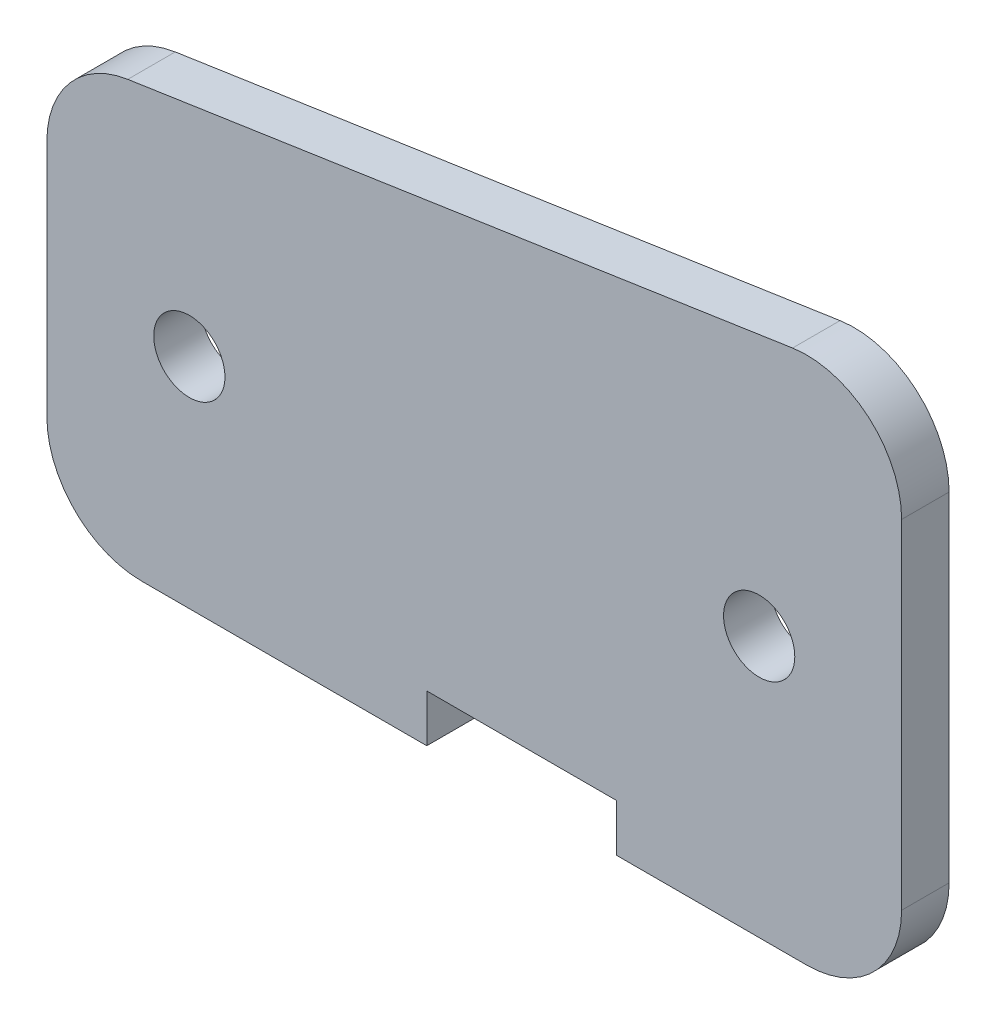
ISO-10303-21;
HEADER;
FILE_DESCRIPTION(('STEP AP214'),'2;1');
FILE_NAME('part.step','',(''),(''),'','','');
FILE_SCHEMA(('AUTOMOTIVE_DESIGN { 1 0 10303 214 1 1 1 1 }'));
ENDSEC;
DATA;
#1=APPLICATION_CONTEXT('core data for automotive mechanical design processes');
#2=APPLICATION_PROTOCOL_DEFINITION('international standard','automotive_design',2000,#1);
#3=PRODUCT_CONTEXT('',#1,'mechanical');
#4=PRODUCT('Part','Part','',(#3));
#5=PRODUCT_RELATED_PRODUCT_CATEGORY('part','',(#4));
#6=PRODUCT_DEFINITION_FORMATION('','',#4);
#7=PRODUCT_DEFINITION_CONTEXT('part definition',#1,'design');
#8=PRODUCT_DEFINITION('design','',#6,#7);
#9=PRODUCT_DEFINITION_SHAPE('','',#8);
#10=(LENGTH_UNIT() NAMED_UNIT(*) SI_UNIT(.MILLI.,.METRE.));
#11=(NAMED_UNIT(*) PLANE_ANGLE_UNIT() SI_UNIT($,.RADIAN.));
#12=(NAMED_UNIT(*) SI_UNIT($,.STERADIAN.) SOLID_ANGLE_UNIT());
#13=UNCERTAINTY_MEASURE_WITH_UNIT(LENGTH_MEASURE(1.E-05),#10,'distance_accuracy_value','');
#14=(GEOMETRIC_REPRESENTATION_CONTEXT(3) GLOBAL_UNCERTAINTY_ASSIGNED_CONTEXT((#13)) GLOBAL_UNIT_ASSIGNED_CONTEXT((#10,
#11,#12)) REPRESENTATION_CONTEXT('',''));
#15=CARTESIAN_POINT('',(0.,0.,0.));
#16=DIRECTION('',(0.,0.,1.));
#17=DIRECTION('',(1.,0.,0.));
#18=AXIS2_PLACEMENT_3D('',#15,#16,#17);
#19=CARTESIAN_POINT('',(-187.325,28.9802098778702,3.175));
#20=DIRECTION('',(0.,0.,-1.));
#21=DIRECTION('',(-1.,0.,0.));
#22=AXIS2_PLACEMENT_3D('',#19,#20,#21);
#23=CYLINDRICAL_SURFACE('',#22,6.35);
#24=CARTESIAN_POINT('',(-187.325,28.9802098778702,0.));
#25=DIRECTION('',(0.,0.,1.));
#26=DIRECTION('',(1.,0.,0.));
#27=AXIS2_PLACEMENT_3D('',#24,#25,#26);
#28=CIRCLE('',#27,6.35);
#29=CARTESIAN_POINT('',(-180.975,28.9802098778702,0.));
#30=VERTEX_POINT('',#29);
#31=CARTESIAN_POINT('',(-188.266961876107,35.2599557185839,0.));
#32=VERTEX_POINT('',#31);
#33=EDGE_CURVE('E160',#30,#32,#28,.T.);
#34=ORIENTED_EDGE('',*,*,#33,.T.);
#35=DIRECTION('',(0.,0.,-1.));
#36=VECTOR('',#35,1.);
#37=CARTESIAN_POINT('',(-188.266961876107,35.2599557185839,3.175));
#38=LINE('',#37,#36);
#39=CARTESIAN_POINT('',(-188.266961876107,35.2599557185839,3.175));
#40=VERTEX_POINT('',#39);
#41=EDGE_CURVE('E11',#40,#32,#38,.T.);
#42=ORIENTED_EDGE('',*,*,#41,.F.);
#43=CARTESIAN_POINT('',(-187.325,28.9802098778702,3.175));
#44=DIRECTION('',(0.,0.,1.));
#45=DIRECTION('',(1.,0.,0.));
#46=AXIS2_PLACEMENT_3D('',#43,#44,#45);
#47=CIRCLE('',#46,6.35);
#48=CARTESIAN_POINT('',(-180.975,28.9802098778702,3.175));
#49=VERTEX_POINT('',#48);
#50=EDGE_CURVE('E100',#49,#40,#47,.T.);
#51=ORIENTED_EDGE('',*,*,#50,.F.);
#52=DIRECTION('',(0.,0.,-1.));
#53=VECTOR('',#52,1.);
#54=CARTESIAN_POINT('',(-180.975,28.9802098778702,3.175));
#55=LINE('',#54,#53);
#56=EDGE_CURVE('E51',#49,#30,#55,.T.);
#57=ORIENTED_EDGE('',*,*,#56,.T.);
#58=EDGE_LOOP('',(#34,#42,#51,#57));
#59=FACE_BOUND('',#58,.T.);
#60=ADVANCED_FACE('F35',(#59),#23,.T.);
#61=CARTESIAN_POINT('',(-9.31540342298288,62.1026894865525,3.175));
#62=DIRECTION('',(-0.148340452930245,0.988936352868297,0.));
#63=DIRECTION('',(-0.988936352868298,-0.148340452930245,0.));
#64=AXIS2_PLACEMENT_3D('',#61,#62,#63);
#65=PLANE('',#64);
#66=DIRECTION('',(0.988936352868298,0.148340452930245,0.));
#67=VECTOR('',#66,1.);
#68=CARTESIAN_POINT('',(-9.31540342298288,62.1026894865525,0.));
#69=LINE('',#68,#67);
#70=CARTESIAN_POINT('',(-232.716961876107,28.5924557185839,0.));
#71=VERTEX_POINT('',#70);
#72=EDGE_CURVE('E162',#71,#32,#69,.T.);
#73=ORIENTED_EDGE('',*,*,#72,.F.);
#74=DIRECTION('',(0.,0.,-1.));
#75=VECTOR('',#74,1.);
#76=CARTESIAN_POINT('',(-232.716961876107,28.5924557185839,3.175));
#77=LINE('',#76,#75);
#78=CARTESIAN_POINT('',(-232.716961876107,28.5924557185839,3.175));
#79=VERTEX_POINT('',#78);
#80=EDGE_CURVE('E43',#79,#71,#77,.T.);
#81=ORIENTED_EDGE('',*,*,#80,.F.);
#82=DIRECTION('',(0.988936352868298,0.148340452930245,0.));
#83=VECTOR('',#82,1.);
#84=CARTESIAN_POINT('',(-9.31540342298288,62.1026894865525,3.175));
#85=LINE('',#84,#83);
#86=EDGE_CURVE('E271',#79,#40,#85,.T.);
#87=ORIENTED_EDGE('',*,*,#86,.T.);
#88=ORIENTED_EDGE('',*,*,#41,.T.);
#89=EDGE_LOOP('',(#73,#81,#87,#88));
#90=FACE_BOUND('',#89,.T.);
#91=ADVANCED_FACE('F221',(#90),#65,.T.);
#92=CARTESIAN_POINT('',(-231.775,22.3127098778702,3.175));
#93=DIRECTION('',(0.,0.,-1.));
#94=DIRECTION('',(-1.,0.,0.));
#95=AXIS2_PLACEMENT_3D('',#92,#93,#94);
#96=CYLINDRICAL_SURFACE('',#95,6.35);
#97=CARTESIAN_POINT('',(-231.775,22.3127098778702,0.));
#98=DIRECTION('',(0.,0.,1.));
#99=DIRECTION('',(1.,0.,0.));
#100=AXIS2_PLACEMENT_3D('',#97,#98,#99);
#101=CIRCLE('',#100,6.35);
#102=CARTESIAN_POINT('',(-238.125,22.3127098778702,0.));
#103=VERTEX_POINT('',#102);
#104=EDGE_CURVE('E165',#103,#71,#101,.F.);
#105=ORIENTED_EDGE('',*,*,#104,.F.);
#106=DIRECTION('',(0.,0.,-1.));
#107=VECTOR('',#106,1.);
#108=CARTESIAN_POINT('',(-238.125,22.3127098778702,3.175));
#109=LINE('',#108,#107);
#110=CARTESIAN_POINT('',(-238.125,22.3127098778702,3.175));
#111=VERTEX_POINT('',#110);
#112=EDGE_CURVE('E211',#111,#103,#109,.T.);
#113=ORIENTED_EDGE('',*,*,#112,.F.);
#114=CARTESIAN_POINT('',(-231.775,22.3127098778702,3.175));
#115=DIRECTION('',(0.,0.,1.));
#116=DIRECTION('',(1.,0.,0.));
#117=AXIS2_PLACEMENT_3D('',#114,#115,#116);
#118=CIRCLE('',#117,6.35);
#119=EDGE_CURVE('E218',#111,#79,#118,.F.);
#120=ORIENTED_EDGE('',*,*,#119,.T.);
#121=ORIENTED_EDGE('',*,*,#80,.T.);
#122=EDGE_LOOP('',(#105,#113,#120,#121));
#123=FACE_BOUND('',#122,.T.);
#124=ADVANCED_FACE('F216',(#123),#96,.T.);
#125=CARTESIAN_POINT('',(-238.125,0.,3.175));
#126=DIRECTION('',(1.,0.,0.));
#127=DIRECTION('',(0.,0.,-1.));
#128=AXIS2_PLACEMENT_3D('',#125,#126,#127);
#129=PLANE('',#128);
#130=DIRECTION('',(0.,-1.,0.));
#131=VECTOR('',#130,1.);
#132=CARTESIAN_POINT('',(-238.125,0.,0.));
#133=LINE('',#132,#131);
#134=CARTESIAN_POINT('',(-238.125,6.35000000000002,0.));
#135=VERTEX_POINT('',#134);
#136=EDGE_CURVE('E168',#103,#135,#133,.T.);
#137=ORIENTED_EDGE('',*,*,#136,.T.);
#138=DIRECTION('',(0.,0.,-1.));
#139=VECTOR('',#138,1.);
#140=CARTESIAN_POINT('',(-238.125,6.35000000000002,3.175));
#141=LINE('',#140,#139);
#142=CARTESIAN_POINT('',(-238.125,6.35000000000002,3.175));
#143=VERTEX_POINT('',#142);
#144=EDGE_CURVE('E208',#143,#135,#141,.T.);
#145=ORIENTED_EDGE('',*,*,#144,.F.);
#146=DIRECTION('',(0.,-1.,0.));
#147=VECTOR('',#146,1.);
#148=CARTESIAN_POINT('',(-238.125,0.,3.175));
#149=LINE('',#148,#147);
#150=EDGE_CURVE('E239',#111,#143,#149,.T.);
#151=ORIENTED_EDGE('',*,*,#150,.F.);
#152=ORIENTED_EDGE('',*,*,#112,.T.);
#153=EDGE_LOOP('',(#137,#145,#151,#152));
#154=FACE_BOUND('',#153,.T.);
#155=ADVANCED_FACE('F229',(#154),#129,.F.);
#156=CARTESIAN_POINT('',(-231.775,6.34999999999997,3.175));
#157=DIRECTION('',(0.,0.,-1.));
#158=DIRECTION('',(-1.,0.,0.));
#159=AXIS2_PLACEMENT_3D('',#156,#157,#158);
#160=CYLINDRICAL_SURFACE('',#159,6.35);
#161=CARTESIAN_POINT('',(-231.775,6.34999999999997,0.));
#162=DIRECTION('',(0.,0.,1.));
#163=DIRECTION('',(1.,0.,0.));
#164=AXIS2_PLACEMENT_3D('',#161,#162,#163);
#165=CIRCLE('',#164,6.35);
#166=CARTESIAN_POINT('',(-231.775,0.,0.));
#167=VERTEX_POINT('',#166);
#168=EDGE_CURVE('E170',#135,#167,#165,.T.);
#169=ORIENTED_EDGE('',*,*,#168,.T.);
#170=DIRECTION('',(0.,0.,-1.));
#171=VECTOR('',#170,1.);
#172=CARTESIAN_POINT('',(-231.775,0.,3.175));
#173=LINE('',#172,#171);
#174=CARTESIAN_POINT('',(-231.775,0.,3.175));
#175=VERTEX_POINT('',#174);
#176=EDGE_CURVE('E206',#175,#167,#173,.T.);
#177=ORIENTED_EDGE('',*,*,#176,.F.);
#178=CARTESIAN_POINT('',(-231.775,6.34999999999997,3.175));
#179=DIRECTION('',(0.,0.,1.));
#180=DIRECTION('',(1.,0.,0.));
#181=AXIS2_PLACEMENT_3D('',#178,#179,#180);
#182=CIRCLE('',#181,6.35);
#183=EDGE_CURVE('E235',#143,#175,#182,.T.);
#184=ORIENTED_EDGE('',*,*,#183,.F.);
#185=ORIENTED_EDGE('',*,*,#144,.T.);
#186=EDGE_LOOP('',(#169,#177,#184,#185));
#187=FACE_BOUND('',#186,.T.);
#188=ADVANCED_FACE('F233',(#187),#160,.T.);
#189=CARTESIAN_POINT('',(0.,0.,3.175));
#190=DIRECTION('',(0.,-1.,0.));
#191=DIRECTION('',(1.,0.,0.));
#192=AXIS2_PLACEMENT_3D('',#189,#190,#191);
#193=PLANE('',#192);
#194=DIRECTION('',(-1.,0.,0.));
#195=VECTOR('',#194,1.);
#196=CARTESIAN_POINT('',(0.,0.,0.));
#197=LINE('',#196,#195);
#198=CARTESIAN_POINT('',(-212.725,0.,0.));
#199=VERTEX_POINT('',#198);
#200=EDGE_CURVE('E173',#199,#167,#197,.T.);
#201=ORIENTED_EDGE('',*,*,#200,.F.);
#202=DIRECTION('',(0.,0.,-1.));
#203=VECTOR('',#202,1.);
#204=CARTESIAN_POINT('',(-212.725,0.,3.175));
#205=LINE('',#204,#203);
#206=CARTESIAN_POINT('',(-212.725,0.,3.175));
#207=VERTEX_POINT('',#206);
#208=EDGE_CURVE('E204',#207,#199,#205,.T.);
#209=ORIENTED_EDGE('',*,*,#208,.F.);
#210=DIRECTION('',(-1.,0.,0.));
#211=VECTOR('',#210,1.);
#212=CARTESIAN_POINT('',(0.,0.,3.175));
#213=LINE('',#212,#211);
#214=EDGE_CURVE('E238',#207,#175,#213,.T.);
#215=ORIENTED_EDGE('',*,*,#214,.T.);
#216=ORIENTED_EDGE('',*,*,#176,.T.);
#217=EDGE_LOOP('',(#201,#209,#215,#216));
#218=FACE_BOUND('',#217,.T.);
#219=ADVANCED_FACE('F283',(#218),#193,.T.);
#220=CARTESIAN_POINT('',(-212.725,0.,3.175));
#221=DIRECTION('',(-1.,0.,0.));
#222=DIRECTION('',(0.,0.,1.));
#223=AXIS2_PLACEMENT_3D('',#220,#221,#222);
#224=PLANE('',#223);
#225=DIRECTION('',(0.,1.,0.));
#226=VECTOR('',#225,1.);
#227=CARTESIAN_POINT('',(-212.725,0.,0.));
#228=LINE('',#227,#226);
#229=CARTESIAN_POINT('',(-212.725,3.17499999999997,0.));
#230=VERTEX_POINT('',#229);
#231=EDGE_CURVE('E176',#199,#230,#228,.T.);
#232=ORIENTED_EDGE('',*,*,#231,.T.);
#233=DIRECTION('',(0.,0.,-1.));
#234=VECTOR('',#233,1.);
#235=CARTESIAN_POINT('',(-212.725,3.17499999999997,3.175));
#236=LINE('',#235,#234);
#237=CARTESIAN_POINT('',(-212.725,3.17499999999997,3.175));
#238=VERTEX_POINT('',#237);
#239=EDGE_CURVE('E201',#238,#230,#236,.T.);
#240=ORIENTED_EDGE('',*,*,#239,.F.);
#241=DIRECTION('',(0.,1.,0.));
#242=VECTOR('',#241,1.);
#243=CARTESIAN_POINT('',(-212.725,0.,3.175));
#244=LINE('',#243,#242);
#245=EDGE_CURVE('E241',#207,#238,#244,.T.);
#246=ORIENTED_EDGE('',*,*,#245,.F.);
#247=ORIENTED_EDGE('',*,*,#208,.T.);
#248=EDGE_LOOP('',(#232,#240,#246,#247));
#249=FACE_BOUND('',#248,.T.);
#250=ADVANCED_FACE('F286',(#249),#224,.F.);
#251=CARTESIAN_POINT('',(0.,3.17499999999999,3.175));
#252=DIRECTION('',(0.,1.,0.));
#253=DIRECTION('',(-1.,0.,0.));
#254=AXIS2_PLACEMENT_3D('',#251,#252,#253);
#255=PLANE('',#254);
#256=DIRECTION('',(1.,0.,0.));
#257=VECTOR('',#256,1.);
#258=CARTESIAN_POINT('',(0.,3.17499999999999,0.));
#259=LINE('',#258,#257);
#260=CARTESIAN_POINT('',(-200.025,3.17499999999997,0.));
#261=VERTEX_POINT('',#260);
#262=EDGE_CURVE('E178',#230,#261,#259,.T.);
#263=ORIENTED_EDGE('',*,*,#262,.T.);
#264=DIRECTION('',(0.,0.,-1.));
#265=VECTOR('',#264,1.);
#266=CARTESIAN_POINT('',(-200.025,3.17499999999997,3.175));
#267=LINE('',#266,#265);
#268=CARTESIAN_POINT('',(-200.025,3.17499999999997,3.175));
#269=VERTEX_POINT('',#268);
#270=EDGE_CURVE('E199',#269,#261,#267,.T.);
#271=ORIENTED_EDGE('',*,*,#270,.F.);
#272=DIRECTION('',(1.,0.,0.));
#273=VECTOR('',#272,1.);
#274=CARTESIAN_POINT('',(0.,3.17499999999999,3.175));
#275=LINE('',#274,#273);
#276=EDGE_CURVE('E247',#238,#269,#275,.T.);
#277=ORIENTED_EDGE('',*,*,#276,.F.);
#278=ORIENTED_EDGE('',*,*,#239,.T.);
#279=EDGE_LOOP('',(#263,#271,#277,#278));
#280=FACE_BOUND('',#279,.T.);
#281=ADVANCED_FACE('F290',(#280),#255,.F.);
#282=CARTESIAN_POINT('',(-200.025,-1.74860126378462E-12,3.175));
#283=DIRECTION('',(-1.,0.,0.));
#284=DIRECTION('',(0.,-1.,0.));
#285=AXIS2_PLACEMENT_3D('',#282,#283,#284);
#286=PLANE('',#285);
#287=DIRECTION('',(0.,1.,0.));
#288=VECTOR('',#287,1.);
#289=CARTESIAN_POINT('',(-200.025,-1.74860126378462E-12,0.));
#290=LINE('',#289,#288);
#291=CARTESIAN_POINT('',(-200.025,0.,0.));
#292=VERTEX_POINT('',#291);
#293=EDGE_CURVE('E181',#292,#261,#290,.T.);
#294=ORIENTED_EDGE('',*,*,#293,.F.);
#295=DIRECTION('',(0.,0.,-1.));
#296=VECTOR('',#295,1.);
#297=CARTESIAN_POINT('',(-200.025,0.,3.175));
#298=LINE('',#297,#296);
#299=CARTESIAN_POINT('',(-200.025,0.,3.175));
#300=VERTEX_POINT('',#299);
#301=EDGE_CURVE('E138',#300,#292,#298,.T.);
#302=ORIENTED_EDGE('',*,*,#301,.F.);
#303=DIRECTION('',(0.,1.,0.));
#304=VECTOR('',#303,1.);
#305=CARTESIAN_POINT('',(-200.025,-1.74860126378462E-12,3.175));
#306=LINE('',#305,#304);
#307=EDGE_CURVE('E146',#300,#269,#306,.T.);
#308=ORIENTED_EDGE('',*,*,#307,.T.);
#309=ORIENTED_EDGE('',*,*,#270,.T.);
#310=EDGE_LOOP('',(#294,#302,#308,#309));
#311=FACE_BOUND('',#310,.T.);
#312=ADVANCED_FACE('F250',(#311),#286,.T.);
#313=CARTESIAN_POINT('',(0.,0.,3.175));
#314=DIRECTION('',(0.,-1.,0.));
#315=DIRECTION('',(1.,0.,0.));
#316=AXIS2_PLACEMENT_3D('',#313,#314,#315);
#317=PLANE('',#316);
#318=DIRECTION('',(-1.,0.,0.));
#319=VECTOR('',#318,1.);
#320=CARTESIAN_POINT('',(0.,0.,0.));
#321=LINE('',#320,#319);
#322=CARTESIAN_POINT('',(-187.325,0.,0.));
#323=VERTEX_POINT('',#322);
#324=EDGE_CURVE('E134',#323,#292,#321,.T.);
#325=ORIENTED_EDGE('',*,*,#324,.F.);
#326=DIRECTION('',(0.,0.,-1.));
#327=VECTOR('',#326,1.);
#328=CARTESIAN_POINT('',(-187.325,0.,3.175));
#329=LINE('',#328,#327);
#330=CARTESIAN_POINT('',(-187.325,0.,3.175));
#331=VERTEX_POINT('',#330);
#332=EDGE_CURVE('E129',#331,#323,#329,.T.);
#333=ORIENTED_EDGE('',*,*,#332,.F.);
#334=DIRECTION('',(-1.,0.,0.));
#335=VECTOR('',#334,1.);
#336=CARTESIAN_POINT('',(0.,0.,3.175));
#337=LINE('',#336,#335);
#338=EDGE_CURVE('E132',#331,#300,#337,.T.);
#339=ORIENTED_EDGE('',*,*,#338,.T.);
#340=ORIENTED_EDGE('',*,*,#301,.T.);
#341=EDGE_LOOP('',(#325,#333,#339,#340));
#342=FACE_BOUND('',#341,.T.);
#343=ADVANCED_FACE('F131',(#342),#317,.T.);
#344=CARTESIAN_POINT('',(-187.325,6.34999999999998,3.175));
#345=DIRECTION('',(0.,0.,-1.));
#346=DIRECTION('',(-1.,0.,0.));
#347=AXIS2_PLACEMENT_3D('',#344,#345,#346);
#348=CYLINDRICAL_SURFACE('',#347,6.35);
#349=CARTESIAN_POINT('',(-187.325,6.34999999999998,0.));
#350=DIRECTION('',(0.,0.,1.));
#351=DIRECTION('',(1.,0.,0.));
#352=AXIS2_PLACEMENT_3D('',#349,#350,#351);
#353=CIRCLE('',#352,6.35);
#354=CARTESIAN_POINT('',(-180.975,6.35000000000002,0.));
#355=VERTEX_POINT('',#354);
#356=EDGE_CURVE('E185',#355,#323,#353,.F.);
#357=ORIENTED_EDGE('',*,*,#356,.F.);
#358=DIRECTION('',(0.,0.,-1.));
#359=VECTOR('',#358,1.);
#360=CARTESIAN_POINT('',(-180.975,6.35000000000002,3.175));
#361=LINE('',#360,#359);
#362=CARTESIAN_POINT('',(-180.975,6.35000000000002,3.175));
#363=VERTEX_POINT('',#362);
#364=EDGE_CURVE('E88',#363,#355,#361,.T.);
#365=ORIENTED_EDGE('',*,*,#364,.F.);
#366=CARTESIAN_POINT('',(-187.325,6.34999999999998,3.175));
#367=DIRECTION('',(0.,0.,1.));
#368=DIRECTION('',(1.,0.,0.));
#369=AXIS2_PLACEMENT_3D('',#366,#367,#368);
#370=CIRCLE('',#369,6.35);
#371=EDGE_CURVE('E144',#363,#331,#370,.F.);
#372=ORIENTED_EDGE('',*,*,#371,.T.);
#373=ORIENTED_EDGE('',*,*,#332,.T.);
#374=EDGE_LOOP('',(#357,#365,#372,#373));
#375=FACE_BOUND('',#374,.T.);
#376=ADVANCED_FACE('F148',(#375),#348,.T.);
#377=CARTESIAN_POINT('',(-228.6,14.6049999999993,3.175));
#378=DIRECTION('',(0.,0.,-1.));
#379=DIRECTION('',(-1.,0.,0.));
#380=AXIS2_PLACEMENT_3D('',#377,#378,#379);
#381=CYLINDRICAL_SURFACE('',#380,2.38125000000001);
#382=CARTESIAN_POINT('',(-228.6,14.6049999999993,3.175));
#383=DIRECTION('',(0.,0.,1.));
#384=DIRECTION('',(1.,0.,0.));
#385=AXIS2_PLACEMENT_3D('',#382,#383,#384);
#386=CIRCLE('',#385,2.38125000000001);
#387=CARTESIAN_POINT('',(-226.21875,14.6049999999993,3.175));
#388=VERTEX_POINT('',#387);
#389=EDGE_CURVE('E151',#388,#388,#386,.T.);
#390=ORIENTED_EDGE('',*,*,#389,.T.);
#391=EDGE_LOOP('',(#390));
#392=FACE_BOUND('',#391,.T.);
#393=CARTESIAN_POINT('',(-228.6,14.6049999999993,0.));
#394=DIRECTION('',(0.,0.,1.));
#395=DIRECTION('',(1.,0.,0.));
#396=AXIS2_PLACEMENT_3D('',#393,#394,#395);
#397=CIRCLE('',#396,2.38125000000001);
#398=CARTESIAN_POINT('',(-226.21875,14.6049999999993,0.));
#399=VERTEX_POINT('',#398);
#400=EDGE_CURVE('E190',#399,#399,#397,.T.);
#401=ORIENTED_EDGE('',*,*,#400,.F.);
#402=EDGE_LOOP('',(#401));
#403=FACE_BOUND('',#402,.T.);
#404=ADVANCED_FACE('F256',(#392,#403),#381,.F.);
#405=CARTESIAN_POINT('',(-180.975,0.,3.175));
#406=DIRECTION('',(1.,0.,0.));
#407=DIRECTION('',(0.,0.,-1.));
#408=AXIS2_PLACEMENT_3D('',#405,#406,#407);
#409=PLANE('',#408);
#410=DIRECTION('',(0.,-1.,0.));
#411=VECTOR('',#410,1.);
#412=CARTESIAN_POINT('',(-180.975,0.,0.));
#413=LINE('',#412,#411);
#414=EDGE_CURVE('E187',#30,#355,#413,.T.);
#415=ORIENTED_EDGE('',*,*,#414,.F.);
#416=ORIENTED_EDGE('',*,*,#56,.F.);
#417=DIRECTION('',(0.,-1.,0.));
#418=VECTOR('',#417,1.);
#419=CARTESIAN_POINT('',(-180.975,0.,3.175));
#420=LINE('',#419,#418);
#421=EDGE_CURVE('E149',#49,#363,#420,.T.);
#422=ORIENTED_EDGE('',*,*,#421,.T.);
#423=ORIENTED_EDGE('',*,*,#364,.T.);
#424=EDGE_LOOP('',(#415,#416,#422,#423));
#425=FACE_BOUND('',#424,.T.);
#426=ADVANCED_FACE('F253',(#425),#409,.T.);
#427=CARTESIAN_POINT('',(-190.5,17.4624999999994,3.175));
#428=DIRECTION('',(0.,0.,-1.));
#429=DIRECTION('',(-1.,0.,0.));
#430=AXIS2_PLACEMENT_3D('',#427,#428,#429);
#431=CYLINDRICAL_SURFACE('',#430,2.38125000000001);
#432=CARTESIAN_POINT('',(-190.5,17.4624999999994,3.175));
#433=DIRECTION('',(0.,0.,1.));
#434=DIRECTION('',(1.,0.,0.));
#435=AXIS2_PLACEMENT_3D('',#432,#433,#434);
#436=CIRCLE('',#435,2.38125000000001);
#437=CARTESIAN_POINT('',(-188.11875,17.4624999999994,3.175));
#438=VERTEX_POINT('',#437);
#439=EDGE_CURVE('E157',#438,#438,#436,.T.);
#440=ORIENTED_EDGE('',*,*,#439,.T.);
#441=EDGE_LOOP('',(#440));
#442=FACE_BOUND('',#441,.T.);
#443=CARTESIAN_POINT('',(-190.5,17.4624999999994,0.));
#444=DIRECTION('',(0.,0.,1.));
#445=DIRECTION('',(1.,0.,0.));
#446=AXIS2_PLACEMENT_3D('',#443,#444,#445);
#447=CIRCLE('',#446,2.38125000000001);
#448=CARTESIAN_POINT('',(-188.11875,17.4624999999994,0.));
#449=VERTEX_POINT('',#448);
#450=EDGE_CURVE('E193',#449,#449,#447,.T.);
#451=ORIENTED_EDGE('',*,*,#450,.F.);
#452=EDGE_LOOP('',(#451));
#453=FACE_BOUND('',#452,.T.);
#454=ADVANCED_FACE('F255',(#442,#453),#431,.F.);
#455=CARTESIAN_POINT('',(0.,0.,3.175));
#456=DIRECTION('',(0.,0.,1.));
#457=DIRECTION('',(1.,0.,0.));
#458=AXIS2_PLACEMENT_3D('',#455,#456,#457);
#459=PLANE('',#458);
#460=ORIENTED_EDGE('',*,*,#50,.T.);
#461=ORIENTED_EDGE('',*,*,#86,.F.);
#462=ORIENTED_EDGE('',*,*,#119,.F.);
#463=ORIENTED_EDGE('',*,*,#150,.T.);
#464=ORIENTED_EDGE('',*,*,#183,.T.);
#465=ORIENTED_EDGE('',*,*,#214,.F.);
#466=ORIENTED_EDGE('',*,*,#245,.T.);
#467=ORIENTED_EDGE('',*,*,#276,.T.);
#468=ORIENTED_EDGE('',*,*,#307,.F.);
#469=ORIENTED_EDGE('',*,*,#338,.F.);
#470=ORIENTED_EDGE('',*,*,#371,.F.);
#471=ORIENTED_EDGE('',*,*,#421,.F.);
#472=EDGE_LOOP('',(#460,#461,#462,#463,#464,#465,#466,#467,#468,#469,#470,#471));
#473=FACE_BOUND('',#472,.T.);
#474=ORIENTED_EDGE('',*,*,#389,.F.);
#475=EDGE_LOOP('',(#474));
#476=FACE_BOUND('',#475,.T.);
#477=ORIENTED_EDGE('',*,*,#439,.F.);
#478=EDGE_LOOP('',(#477));
#479=FACE_BOUND('',#478,.T.);
#480=ADVANCED_FACE('F142',(#473,#476,#479),#459,.T.);
#481=CARTESIAN_POINT('',(0.,0.,0.));
#482=DIRECTION('',(0.,0.,1.));
#483=DIRECTION('',(1.,0.,0.));
#484=AXIS2_PLACEMENT_3D('',#481,#482,#483);
#485=PLANE('',#484);
#486=ORIENTED_EDGE('',*,*,#33,.F.);
#487=ORIENTED_EDGE('',*,*,#414,.T.);
#488=ORIENTED_EDGE('',*,*,#356,.T.);
#489=ORIENTED_EDGE('',*,*,#324,.T.);
#490=ORIENTED_EDGE('',*,*,#293,.T.);
#491=ORIENTED_EDGE('',*,*,#262,.F.);
#492=ORIENTED_EDGE('',*,*,#231,.F.);
#493=ORIENTED_EDGE('',*,*,#200,.T.);
#494=ORIENTED_EDGE('',*,*,#168,.F.);
#495=ORIENTED_EDGE('',*,*,#136,.F.);
#496=ORIENTED_EDGE('',*,*,#104,.T.);
#497=ORIENTED_EDGE('',*,*,#72,.T.);
#498=EDGE_LOOP('',(#486,#487,#488,#489,#490,#491,#492,#493,#494,#495,#496,#497));
#499=FACE_BOUND('',#498,.T.);
#500=ORIENTED_EDGE('',*,*,#400,.T.);
#501=EDGE_LOOP('',(#500));
#502=FACE_BOUND('',#501,.T.);
#503=ORIENTED_EDGE('',*,*,#450,.T.);
#504=EDGE_LOOP('',(#503));
#505=FACE_BOUND('',#504,.T.);
#506=ADVANCED_FACE('F224',(#499,#502,#505),#485,.F.);
#507=CLOSED_SHELL('',(#60,#91,#124,#155,#188,#219,#250,#281,#312,#343,#376,#404,#426,#454,#480,#506));
#508=MANIFOLD_SOLID_BREP('B2',#507);
#509=ADVANCED_BREP_SHAPE_REPRESENTATION('',(#18,#508),#14);
#510=SHAPE_DEFINITION_REPRESENTATION(#9,#509);
ENDSEC;
END-ISO-10303-21;
